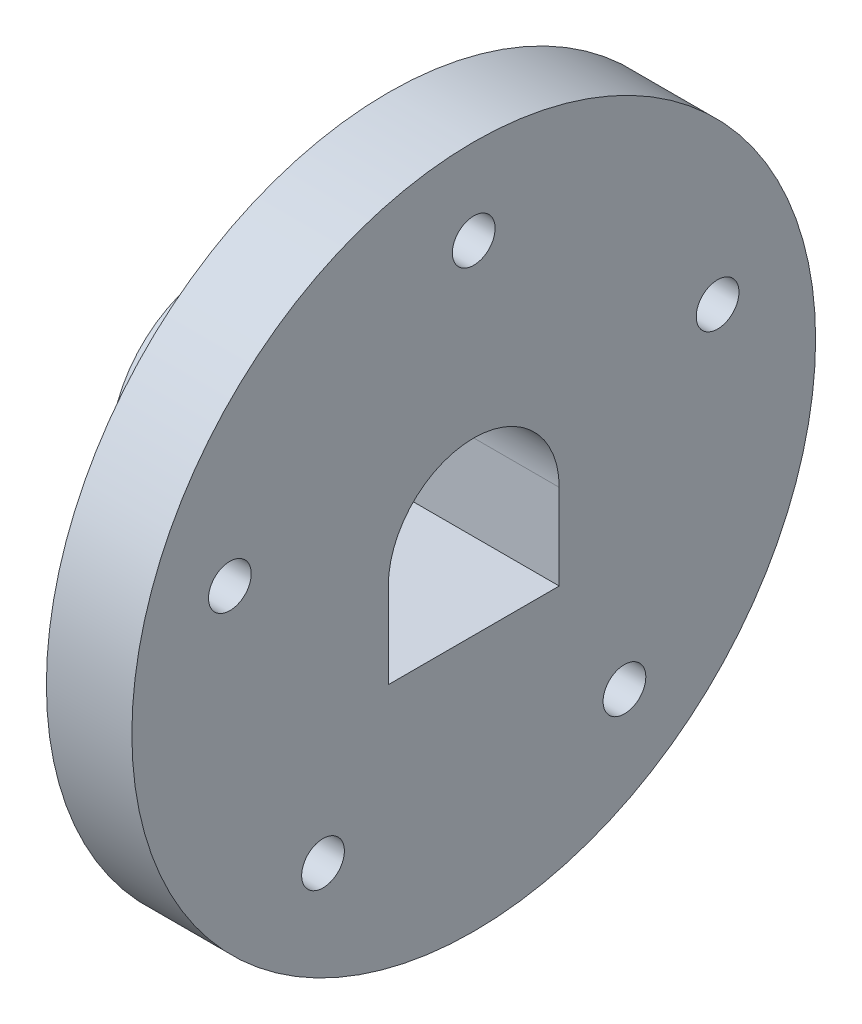
ISO-10303-21;
HEADER;
FILE_DESCRIPTION(('STEP AP214'),'2;1');
FILE_NAME('part.step','',(''),(''),'','','');
FILE_SCHEMA(('AUTOMOTIVE_DESIGN { 1 0 10303 214 1 1 1 1 }'));
ENDSEC;
DATA;
#1=APPLICATION_CONTEXT('core data for automotive mechanical design processes');
#2=APPLICATION_PROTOCOL_DEFINITION('international standard','automotive_design',2000,#1);
#3=PRODUCT_CONTEXT('',#1,'mechanical');
#4=PRODUCT('Part','Part','',(#3));
#5=PRODUCT_RELATED_PRODUCT_CATEGORY('part','',(#4));
#6=PRODUCT_DEFINITION_FORMATION('','',#4);
#7=PRODUCT_DEFINITION_CONTEXT('part definition',#1,'design');
#8=PRODUCT_DEFINITION('design','',#6,#7);
#9=PRODUCT_DEFINITION_SHAPE('','',#8);
#10=(LENGTH_UNIT() NAMED_UNIT(*) SI_UNIT(.MILLI.,.METRE.));
#11=(NAMED_UNIT(*) PLANE_ANGLE_UNIT() SI_UNIT($,.RADIAN.));
#12=(NAMED_UNIT(*) SI_UNIT($,.STERADIAN.) SOLID_ANGLE_UNIT());
#13=UNCERTAINTY_MEASURE_WITH_UNIT(LENGTH_MEASURE(1.E-05),#10,'distance_accuracy_value','');
#14=(GEOMETRIC_REPRESENTATION_CONTEXT(3) GLOBAL_UNCERTAINTY_ASSIGNED_CONTEXT((#13)) GLOBAL_UNIT_ASSIGNED_CONTEXT((#10,
#11,#12)) REPRESENTATION_CONTEXT('',''));
#15=CARTESIAN_POINT('',(0.,0.,0.));
#16=DIRECTION('',(0.,0.,1.));
#17=DIRECTION('',(1.,0.,0.));
#18=AXIS2_PLACEMENT_3D('',#15,#16,#17);
#19=CARTESIAN_POINT('',(-1.,0.,0.));
#20=DIRECTION('',(1.,0.,0.));
#21=DIRECTION('',(0.,0.,-1.));
#22=AXIS2_PLACEMENT_3D('',#19,#20,#21);
#23=PLANE('',#22);
#24=CARTESIAN_POINT('',(-1.,0.,0.));
#25=DIRECTION('',(1.,0.,0.));
#26=DIRECTION('',(0.,0.,-1.));
#27=AXIS2_PLACEMENT_3D('',#24,#25,#26);
#28=CIRCLE('',#27,4.);
#29=CARTESIAN_POINT('',(-1.,0.,-4.));
#30=VERTEX_POINT('',#29);
#31=EDGE_CURVE('E11',#30,#30,#28,.T.);
#32=ORIENTED_EDGE('',*,*,#31,.F.);
#33=EDGE_LOOP('',(#32));
#34=FACE_BOUND('',#33,.T.);
#35=CARTESIAN_POINT('',(-1.,3.,0.));
#36=DIRECTION('',(1.,0.,0.));
#37=DIRECTION('',(0.,0.,-1.));
#38=AXIS2_PLACEMENT_3D('',#35,#36,#37);
#39=CIRCLE('',#38,0.25);
#40=CARTESIAN_POINT('',(-1.,3.,-0.25));
#41=VERTEX_POINT('',#40);
#42=EDGE_CURVE('E190',#41,#41,#39,.T.);
#43=ORIENTED_EDGE('',*,*,#42,.T.);
#44=EDGE_LOOP('',(#43));
#45=FACE_BOUND('',#44,.T.);
#46=CARTESIAN_POINT('',(-1.,0.927050983124834,2.85316954888546));
#47=DIRECTION('',(1.,0.,0.));
#48=DIRECTION('',(0.,0.,-1.));
#49=AXIS2_PLACEMENT_3D('',#46,#47,#48);
#50=CIRCLE('',#49,0.25);
#51=CARTESIAN_POINT('',(-1.,0.927050983124834,2.60316954888546));
#52=VERTEX_POINT('',#51);
#53=EDGE_CURVE('E184',#52,#52,#50,.T.);
#54=ORIENTED_EDGE('',*,*,#53,.T.);
#55=EDGE_LOOP('',(#54));
#56=FACE_BOUND('',#55,.T.);
#57=CARTESIAN_POINT('',(-1.,0.927050983124875,-2.85316954888545));
#58=DIRECTION('',(1.,0.,0.));
#59=DIRECTION('',(0.,0.,-1.));
#60=AXIS2_PLACEMENT_3D('',#57,#58,#59);
#61=CIRCLE('',#60,0.25);
#62=CARTESIAN_POINT('',(-1.,0.927050983124875,-3.10316954888545));
#63=VERTEX_POINT('',#62);
#64=EDGE_CURVE('E167',#63,#63,#61,.T.);
#65=ORIENTED_EDGE('',*,*,#64,.T.);
#66=EDGE_LOOP('',(#65));
#67=FACE_BOUND('',#66,.T.);
#68=CARTESIAN_POINT('',(-1.,-2.42705098312483,-1.76335575687744));
#69=DIRECTION('',(1.,0.,0.));
#70=DIRECTION('',(0.,0.,-1.));
#71=AXIS2_PLACEMENT_3D('',#68,#69,#70);
#72=CIRCLE('',#71,0.25);
#73=CARTESIAN_POINT('',(-1.,-2.42705098312483,-2.01335575687744));
#74=VERTEX_POINT('',#73);
#75=EDGE_CURVE('E175',#74,#74,#72,.T.);
#76=ORIENTED_EDGE('',*,*,#75,.T.);
#77=EDGE_LOOP('',(#76));
#78=FACE_BOUND('',#77,.T.);
#79=CARTESIAN_POINT('',(-1.,-2.42705098312485,1.76335575687741));
#80=DIRECTION('',(1.,0.,0.));
#81=DIRECTION('',(0.,0.,-1.));
#82=AXIS2_PLACEMENT_3D('',#79,#80,#81);
#83=CIRCLE('',#82,0.25);
#84=CARTESIAN_POINT('',(-1.,-2.42705098312485,1.51335575687741));
#85=VERTEX_POINT('',#84);
#86=EDGE_CURVE('E178',#85,#85,#83,.T.);
#87=ORIENTED_EDGE('',*,*,#86,.T.);
#88=EDGE_LOOP('',(#87));
#89=FACE_BOUND('',#88,.T.);
#90=DIRECTION('',(0.,0.,1.));
#91=VECTOR('',#90,1.);
#92=CARTESIAN_POINT('',(-1.,-1.25,0.));
#93=LINE('',#92,#91);
#94=CARTESIAN_POINT('',(-1.,-1.25,-1.25));
#95=VERTEX_POINT('',#94);
#96=CARTESIAN_POINT('',(-1.,-1.25,1.25));
#97=VERTEX_POINT('',#96);
#98=EDGE_CURVE('E136',#95,#97,#93,.T.);
#99=ORIENTED_EDGE('',*,*,#98,.F.);
#100=DIRECTION('',(0.,-1.,0.));
#101=VECTOR('',#100,1.);
#102=CARTESIAN_POINT('',(-1.,0.,-1.25));
#103=LINE('',#102,#101);
#104=CARTESIAN_POINT('',(-1.,0.,-1.25));
#105=VERTEX_POINT('',#104);
#106=EDGE_CURVE('E117',#105,#95,#103,.T.);
#107=ORIENTED_EDGE('',*,*,#106,.F.);
#108=CARTESIAN_POINT('',(-1.,0.,0.));
#109=DIRECTION('',(-1.,0.,0.));
#110=DIRECTION('',(0.,0.,1.));
#111=AXIS2_PLACEMENT_3D('',#108,#109,#110);
#112=CIRCLE('',#111,1.25);
#113=CARTESIAN_POINT('',(-1.,0.,1.25));
#114=VERTEX_POINT('',#113);
#115=EDGE_CURVE('E52',#114,#105,#112,.T.);
#116=ORIENTED_EDGE('',*,*,#115,.F.);
#117=DIRECTION('',(0.,1.,0.));
#118=VECTOR('',#117,1.);
#119=CARTESIAN_POINT('',(-1.,0.,1.25));
#120=LINE('',#119,#118);
#121=EDGE_CURVE('E47',#97,#114,#120,.T.);
#122=ORIENTED_EDGE('',*,*,#121,.F.);
#123=EDGE_LOOP('',(#99,#107,#116,#122));
#124=FACE_BOUND('',#123,.T.);
#125=ADVANCED_FACE('F32',(#34,#45,#56,#67,#78,#89,#124),#23,.F.);
#126=CARTESIAN_POINT('',(-2.5,0.,0.));
#127=DIRECTION('',(1.,0.,0.));
#128=DIRECTION('',(0.,0.,-1.));
#129=AXIS2_PLACEMENT_3D('',#126,#127,#128);
#130=CYLINDRICAL_SURFACE('',#129,1.);
#131=CARTESIAN_POINT('',(0.,0.,0.));
#132=DIRECTION('',(1.,0.,0.));
#133=DIRECTION('',(0.,0.,-1.));
#134=AXIS2_PLACEMENT_3D('',#131,#132,#133);
#135=CIRCLE('',#134,1.);
#136=CARTESIAN_POINT('',(0.,0.,-1.));
#137=VERTEX_POINT('',#136);
#138=CARTESIAN_POINT('',(0.,0.,1.));
#139=VERTEX_POINT('',#138);
#140=EDGE_CURVE('E193',#137,#139,#135,.T.);
#141=ORIENTED_EDGE('',*,*,#140,.T.);
#142=DIRECTION('',(-1.,0.,0.));
#143=VECTOR('',#142,1.);
#144=CARTESIAN_POINT('',(0.,0.,1.));
#145=LINE('',#144,#143);
#146=CARTESIAN_POINT('',(-3.,0.,1.));
#147=VERTEX_POINT('',#146);
#148=EDGE_CURVE('E152',#139,#147,#145,.T.);
#149=ORIENTED_EDGE('',*,*,#148,.T.);
#150=CARTESIAN_POINT('',(-3.,0.,0.));
#151=DIRECTION('',(-1.,0.,0.));
#152=DIRECTION('',(0.,0.,1.));
#153=AXIS2_PLACEMENT_3D('',#150,#151,#152);
#154=CIRCLE('',#153,1.);
#155=CARTESIAN_POINT('',(-3.,0.,-1.));
#156=VERTEX_POINT('',#155);
#157=EDGE_CURVE('E116',#156,#147,#154,.F.);
#158=ORIENTED_EDGE('',*,*,#157,.F.);
#159=DIRECTION('',(-1.,0.,0.));
#160=VECTOR('',#159,1.);
#161=CARTESIAN_POINT('',(0.,0.,-1.));
#162=LINE('',#161,#160);
#163=EDGE_CURVE('E160',#137,#156,#162,.T.);
#164=ORIENTED_EDGE('',*,*,#163,.F.);
#165=EDGE_LOOP('',(#141,#149,#158,#164));
#166=FACE_BOUND('',#165,.T.);
#167=ADVANCED_FACE('F204',(#166),#130,.F.);
#168=CARTESIAN_POINT('',(-1.,0.,0.));
#169=DIRECTION('',(1.,0.,0.));
#170=DIRECTION('',(0.,0.,-1.));
#171=AXIS2_PLACEMENT_3D('',#168,#169,#170);
#172=CYLINDRICAL_SURFACE('',#171,4.);
#173=ORIENTED_EDGE('',*,*,#31,.T.);
#174=EDGE_LOOP('',(#173));
#175=FACE_BOUND('',#174,.T.);
#176=CARTESIAN_POINT('',(0.,0.,0.));
#177=DIRECTION('',(1.,0.,0.));
#178=DIRECTION('',(0.,0.,-1.));
#179=AXIS2_PLACEMENT_3D('',#176,#177,#178);
#180=CIRCLE('',#179,4.);
#181=CARTESIAN_POINT('',(0.,0.,-4.));
#182=VERTEX_POINT('',#181);
#183=EDGE_CURVE('E36',#182,#182,#180,.T.);
#184=ORIENTED_EDGE('',*,*,#183,.F.);
#185=EDGE_LOOP('',(#184));
#186=FACE_BOUND('',#185,.T.);
#187=ADVANCED_FACE('F34',(#175,#186),#172,.T.);
#188=CARTESIAN_POINT('',(0.,0.,0.));
#189=DIRECTION('',(1.,0.,0.));
#190=DIRECTION('',(0.,0.,-1.));
#191=AXIS2_PLACEMENT_3D('',#188,#189,#190);
#192=PLANE('',#191);
#193=DIRECTION('',(0.,0.,1.));
#194=VECTOR('',#193,1.);
#195=CARTESIAN_POINT('',(0.,-1.,0.));
#196=LINE('',#195,#194);
#197=CARTESIAN_POINT('',(0.,-1.,-1.));
#198=VERTEX_POINT('',#197);
#199=CARTESIAN_POINT('',(0.,-1.,1.));
#200=VERTEX_POINT('',#199);
#201=EDGE_CURVE('E158',#198,#200,#196,.T.);
#202=ORIENTED_EDGE('',*,*,#201,.T.);
#203=DIRECTION('',(0.,1.,0.));
#204=VECTOR('',#203,1.);
#205=CARTESIAN_POINT('',(0.,0.,1.));
#206=LINE('',#205,#204);
#207=EDGE_CURVE('E101',#200,#139,#206,.T.);
#208=ORIENTED_EDGE('',*,*,#207,.T.);
#209=ORIENTED_EDGE('',*,*,#140,.F.);
#210=DIRECTION('',(0.,-1.,0.));
#211=VECTOR('',#210,1.);
#212=CARTESIAN_POINT('',(0.,0.,-1.));
#213=LINE('',#212,#211);
#214=EDGE_CURVE('E154',#137,#198,#213,.T.);
#215=ORIENTED_EDGE('',*,*,#214,.T.);
#216=EDGE_LOOP('',(#202,#208,#209,#215));
#217=FACE_BOUND('',#216,.T.);
#218=CARTESIAN_POINT('',(0.,-2.42705098312485,1.76335575687741));
#219=DIRECTION('',(1.,0.,0.));
#220=DIRECTION('',(0.,0.587785252292469,0.809016994374951));
#221=AXIS2_PLACEMENT_3D('',#218,#219,#220);
#222=CIRCLE('',#221,0.25);
#223=CARTESIAN_POINT('',(0.,-2.28010467005174,1.96561000547114));
#224=VERTEX_POINT('',#223);
#225=EDGE_CURVE('E164',#224,#224,#222,.T.);
#226=ORIENTED_EDGE('',*,*,#225,.F.);
#227=EDGE_LOOP('',(#226));
#228=FACE_BOUND('',#227,.T.);
#229=CARTESIAN_POINT('',(0.,-2.42705098312483,-1.76335575687744));
#230=DIRECTION('',(1.,0.,0.));
#231=DIRECTION('',(0.,-0.58778525229248,0.809016994374942));
#232=AXIS2_PLACEMENT_3D('',#229,#230,#231);
#233=CIRCLE('',#232,0.25);
#234=CARTESIAN_POINT('',(0.,-2.57399729619795,-1.56110150828371));
#235=VERTEX_POINT('',#234);
#236=EDGE_CURVE('E168',#235,#235,#233,.T.);
#237=ORIENTED_EDGE('',*,*,#236,.F.);
#238=EDGE_LOOP('',(#237));
#239=FACE_BOUND('',#238,.T.);
#240=CARTESIAN_POINT('',(0.,0.927050983124875,-2.85316954888545));
#241=DIRECTION('',(1.,0.,0.));
#242=DIRECTION('',(0.,-0.95105651629515,-0.309016994374958));
#243=AXIS2_PLACEMENT_3D('',#240,#241,#242);
#244=CIRCLE('',#243,0.25);
#245=CARTESIAN_POINT('',(0.,0.689286854051087,-2.93042379747919));
#246=VERTEX_POINT('',#245);
#247=EDGE_CURVE('E162',#246,#246,#244,.T.);
#248=ORIENTED_EDGE('',*,*,#247,.F.);
#249=EDGE_LOOP('',(#248));
#250=FACE_BOUND('',#249,.T.);
#251=CARTESIAN_POINT('',(0.,0.927050983124834,2.85316954888546));
#252=DIRECTION('',(1.,0.,0.));
#253=DIRECTION('',(0.,0.951056516295155,-0.309016994374945));
#254=AXIS2_PLACEMENT_3D('',#251,#252,#253);
#255=CIRCLE('',#254,0.25);
#256=CARTESIAN_POINT('',(0.,1.16481511219862,2.77591530029173));
#257=VERTEX_POINT('',#256);
#258=EDGE_CURVE('E181',#257,#257,#255,.T.);
#259=ORIENTED_EDGE('',*,*,#258,.F.);
#260=EDGE_LOOP('',(#259));
#261=FACE_BOUND('',#260,.T.);
#262=CARTESIAN_POINT('',(0.,3.,0.));
#263=DIRECTION('',(1.,0.,0.));
#264=DIRECTION('',(0.,0.,-1.));
#265=AXIS2_PLACEMENT_3D('',#262,#263,#264);
#266=CIRCLE('',#265,0.25);
#267=CARTESIAN_POINT('',(0.,3.,-0.25));
#268=VERTEX_POINT('',#267);
#269=EDGE_CURVE('E187',#268,#268,#266,.T.);
#270=ORIENTED_EDGE('',*,*,#269,.F.);
#271=EDGE_LOOP('',(#270));
#272=FACE_BOUND('',#271,.T.);
#273=ORIENTED_EDGE('',*,*,#183,.T.);
#274=EDGE_LOOP('',(#273));
#275=FACE_BOUND('',#274,.T.);
#276=ADVANCED_FACE('F201',(#217,#228,#239,#250,#261,#272,#275),#192,.T.);
#277=CARTESIAN_POINT('',(-2.,3.,0.));
#278=DIRECTION('',(1.,0.,0.));
#279=DIRECTION('',(0.,0.,-1.));
#280=AXIS2_PLACEMENT_3D('',#277,#278,#279);
#281=CYLINDRICAL_SURFACE('',#280,0.25);
#282=ORIENTED_EDGE('',*,*,#269,.T.);
#283=EDGE_LOOP('',(#282));
#284=FACE_BOUND('',#283,.T.);
#285=ORIENTED_EDGE('',*,*,#42,.F.);
#286=EDGE_LOOP('',(#285));
#287=FACE_BOUND('',#286,.T.);
#288=ADVANCED_FACE('F210',(#284,#287),#281,.F.);
#289=CARTESIAN_POINT('',(-2.,0.927050983124834,2.85316954888546));
#290=DIRECTION('',(1.,0.,0.));
#291=DIRECTION('',(0.,0.,-1.));
#292=AXIS2_PLACEMENT_3D('',#289,#290,#291);
#293=CYLINDRICAL_SURFACE('',#292,0.25);
#294=ORIENTED_EDGE('',*,*,#258,.T.);
#295=EDGE_LOOP('',(#294));
#296=FACE_BOUND('',#295,.T.);
#297=ORIENTED_EDGE('',*,*,#53,.F.);
#298=EDGE_LOOP('',(#297));
#299=FACE_BOUND('',#298,.T.);
#300=ADVANCED_FACE('F223',(#296,#299),#293,.F.);
#301=CARTESIAN_POINT('',(-2.,0.927050983124875,-2.85316954888545));
#302=DIRECTION('',(1.,0.,0.));
#303=DIRECTION('',(0.,0.,-1.));
#304=AXIS2_PLACEMENT_3D('',#301,#302,#303);
#305=CYLINDRICAL_SURFACE('',#304,0.25);
#306=ORIENTED_EDGE('',*,*,#247,.T.);
#307=EDGE_LOOP('',(#306));
#308=FACE_BOUND('',#307,.T.);
#309=ORIENTED_EDGE('',*,*,#64,.F.);
#310=EDGE_LOOP('',(#309));
#311=FACE_BOUND('',#310,.T.);
#312=ADVANCED_FACE('F227',(#308,#311),#305,.F.);
#313=CARTESIAN_POINT('',(-2.,-2.42705098312483,-1.76335575687744));
#314=DIRECTION('',(1.,0.,0.));
#315=DIRECTION('',(0.,0.,-1.));
#316=AXIS2_PLACEMENT_3D('',#313,#314,#315);
#317=CYLINDRICAL_SURFACE('',#316,0.25);
#318=ORIENTED_EDGE('',*,*,#236,.T.);
#319=EDGE_LOOP('',(#318));
#320=FACE_BOUND('',#319,.T.);
#321=ORIENTED_EDGE('',*,*,#75,.F.);
#322=EDGE_LOOP('',(#321));
#323=FACE_BOUND('',#322,.T.);
#324=ADVANCED_FACE('F231',(#320,#323),#317,.F.);
#325=CARTESIAN_POINT('',(-2.,-2.42705098312485,1.76335575687741));
#326=DIRECTION('',(1.,0.,0.));
#327=DIRECTION('',(0.,0.,-1.));
#328=AXIS2_PLACEMENT_3D('',#325,#326,#327);
#329=CYLINDRICAL_SURFACE('',#328,0.25);
#330=ORIENTED_EDGE('',*,*,#225,.T.);
#331=EDGE_LOOP('',(#330));
#332=FACE_BOUND('',#331,.T.);
#333=ORIENTED_EDGE('',*,*,#86,.F.);
#334=EDGE_LOOP('',(#333));
#335=FACE_BOUND('',#334,.T.);
#336=ADVANCED_FACE('F235',(#332,#335),#329,.F.);
#337=CARTESIAN_POINT('',(0.,0.,-1.));
#338=DIRECTION('',(0.,0.,-1.));
#339=DIRECTION('',(-1.,0.,0.));
#340=AXIS2_PLACEMENT_3D('',#337,#338,#339);
#341=PLANE('',#340);
#342=ORIENTED_EDGE('',*,*,#163,.T.);
#343=DIRECTION('',(0.,-1.,0.));
#344=VECTOR('',#343,1.);
#345=CARTESIAN_POINT('',(-3.,0.,-1.));
#346=LINE('',#345,#344);
#347=CARTESIAN_POINT('',(-3.,-1.,-1.));
#348=VERTEX_POINT('',#347);
#349=EDGE_CURVE('E121',#156,#348,#346,.T.);
#350=ORIENTED_EDGE('',*,*,#349,.T.);
#351=DIRECTION('',(-1.,0.,0.));
#352=VECTOR('',#351,1.);
#353=CARTESIAN_POINT('',(0.,-1.,-1.));
#354=LINE('',#353,#352);
#355=EDGE_CURVE('E120',#198,#348,#354,.T.);
#356=ORIENTED_EDGE('',*,*,#355,.F.);
#357=ORIENTED_EDGE('',*,*,#214,.F.);
#358=EDGE_LOOP('',(#342,#350,#356,#357));
#359=FACE_BOUND('',#358,.T.);
#360=ADVANCED_FACE('F239',(#359),#341,.F.);
#361=CARTESIAN_POINT('',(0.,-1.,0.));
#362=DIRECTION('',(0.,-1.,0.));
#363=DIRECTION('',(0.,0.,-1.));
#364=AXIS2_PLACEMENT_3D('',#361,#362,#363);
#365=PLANE('',#364);
#366=ORIENTED_EDGE('',*,*,#355,.T.);
#367=DIRECTION('',(0.,0.,1.));
#368=VECTOR('',#367,1.);
#369=CARTESIAN_POINT('',(-3.,-1.,0.));
#370=LINE('',#369,#368);
#371=CARTESIAN_POINT('',(-3.,-1.,1.));
#372=VERTEX_POINT('',#371);
#373=EDGE_CURVE('E113',#348,#372,#370,.T.);
#374=ORIENTED_EDGE('',*,*,#373,.T.);
#375=DIRECTION('',(-1.,0.,0.));
#376=VECTOR('',#375,1.);
#377=CARTESIAN_POINT('',(0.,-1.,1.));
#378=LINE('',#377,#376);
#379=EDGE_CURVE('E96',#200,#372,#378,.T.);
#380=ORIENTED_EDGE('',*,*,#379,.F.);
#381=ORIENTED_EDGE('',*,*,#201,.F.);
#382=EDGE_LOOP('',(#366,#374,#380,#381));
#383=FACE_BOUND('',#382,.T.);
#384=ADVANCED_FACE('F119',(#383),#365,.F.);
#385=CARTESIAN_POINT('',(0.,0.,1.));
#386=DIRECTION('',(0.,0.,1.));
#387=DIRECTION('',(1.,0.,0.));
#388=AXIS2_PLACEMENT_3D('',#385,#386,#387);
#389=PLANE('',#388);
#390=ORIENTED_EDGE('',*,*,#379,.T.);
#391=DIRECTION('',(0.,1.,0.));
#392=VECTOR('',#391,1.);
#393=CARTESIAN_POINT('',(-3.,0.,1.));
#394=LINE('',#393,#392);
#395=EDGE_CURVE('E99',#372,#147,#394,.T.);
#396=ORIENTED_EDGE('',*,*,#395,.T.);
#397=ORIENTED_EDGE('',*,*,#148,.F.);
#398=ORIENTED_EDGE('',*,*,#207,.F.);
#399=EDGE_LOOP('',(#390,#396,#397,#398));
#400=FACE_BOUND('',#399,.T.);
#401=ADVANCED_FACE('F98',(#400),#389,.F.);
#402=CARTESIAN_POINT('',(-3.,-1.25,0.));
#403=DIRECTION('',(0.,1.,0.));
#404=DIRECTION('',(0.,0.,1.));
#405=AXIS2_PLACEMENT_3D('',#402,#403,#404);
#406=PLANE('',#405);
#407=ORIENTED_EDGE('',*,*,#98,.T.);
#408=DIRECTION('',(1.,0.,0.));
#409=VECTOR('',#408,1.);
#410=CARTESIAN_POINT('',(-3.,-1.25,1.25));
#411=LINE('',#410,#409);
#412=CARTESIAN_POINT('',(-3.,-1.25,1.25));
#413=VERTEX_POINT('',#412);
#414=EDGE_CURVE('E105',#413,#97,#411,.T.);
#415=ORIENTED_EDGE('',*,*,#414,.F.);
#416=DIRECTION('',(0.,0.,1.));
#417=VECTOR('',#416,1.);
#418=CARTESIAN_POINT('',(-3.,-1.25,0.));
#419=LINE('',#418,#417);
#420=CARTESIAN_POINT('',(-3.,-1.25,-1.25));
#421=VERTEX_POINT('',#420);
#422=EDGE_CURVE('E126',#421,#413,#419,.T.);
#423=ORIENTED_EDGE('',*,*,#422,.F.);
#424=DIRECTION('',(1.,0.,0.));
#425=VECTOR('',#424,1.);
#426=CARTESIAN_POINT('',(-3.,-1.25,-1.25));
#427=LINE('',#426,#425);
#428=EDGE_CURVE('E135',#421,#95,#427,.T.);
#429=ORIENTED_EDGE('',*,*,#428,.T.);
#430=EDGE_LOOP('',(#407,#415,#423,#429));
#431=FACE_BOUND('',#430,.T.);
#432=ADVANCED_FACE('F248',(#431),#406,.F.);
#433=CARTESIAN_POINT('',(-3.,0.,1.25));
#434=DIRECTION('',(0.,0.,-1.));
#435=DIRECTION('',(0.,1.,0.));
#436=AXIS2_PLACEMENT_3D('',#433,#434,#435);
#437=PLANE('',#436);
#438=ORIENTED_EDGE('',*,*,#121,.T.);
#439=DIRECTION('',(1.,0.,0.));
#440=VECTOR('',#439,1.);
#441=CARTESIAN_POINT('',(-3.,0.,1.25));
#442=LINE('',#441,#440);
#443=CARTESIAN_POINT('',(-3.,0.,1.25));
#444=VERTEX_POINT('',#443);
#445=EDGE_CURVE('E148',#444,#114,#442,.T.);
#446=ORIENTED_EDGE('',*,*,#445,.F.);
#447=DIRECTION('',(0.,1.,0.));
#448=VECTOR('',#447,1.);
#449=CARTESIAN_POINT('',(-3.,0.,1.25));
#450=LINE('',#449,#448);
#451=EDGE_CURVE('E129',#413,#444,#450,.T.);
#452=ORIENTED_EDGE('',*,*,#451,.F.);
#453=ORIENTED_EDGE('',*,*,#414,.T.);
#454=EDGE_LOOP('',(#438,#446,#452,#453));
#455=FACE_BOUND('',#454,.T.);
#456=ADVANCED_FACE('F251',(#455),#437,.F.);
#457=CARTESIAN_POINT('',(-3.,0.,0.));
#458=DIRECTION('',(1.,0.,0.));
#459=DIRECTION('',(0.,0.,-1.));
#460=AXIS2_PLACEMENT_3D('',#457,#458,#459);
#461=CYLINDRICAL_SURFACE('',#460,1.25);
#462=ORIENTED_EDGE('',*,*,#115,.T.);
#463=DIRECTION('',(1.,0.,0.));
#464=VECTOR('',#463,1.);
#465=CARTESIAN_POINT('',(-3.,0.,-1.25));
#466=LINE('',#465,#464);
#467=CARTESIAN_POINT('',(-3.,0.,-1.25));
#468=VERTEX_POINT('',#467);
#469=EDGE_CURVE('E145',#468,#105,#466,.T.);
#470=ORIENTED_EDGE('',*,*,#469,.F.);
#471=CARTESIAN_POINT('',(-3.,0.,0.));
#472=DIRECTION('',(-1.,0.,0.));
#473=DIRECTION('',(0.,0.,1.));
#474=AXIS2_PLACEMENT_3D('',#471,#472,#473);
#475=CIRCLE('',#474,1.25);
#476=EDGE_CURVE('E131',#444,#468,#475,.T.);
#477=ORIENTED_EDGE('',*,*,#476,.F.);
#478=ORIENTED_EDGE('',*,*,#445,.T.);
#479=EDGE_LOOP('',(#462,#470,#477,#478));
#480=FACE_BOUND('',#479,.T.);
#481=ADVANCED_FACE('F255',(#480),#461,.T.);
#482=CARTESIAN_POINT('',(-3.,0.,-1.25));
#483=DIRECTION('',(0.,0.,1.));
#484=DIRECTION('',(0.,-1.,0.));
#485=AXIS2_PLACEMENT_3D('',#482,#483,#484);
#486=PLANE('',#485);
#487=ORIENTED_EDGE('',*,*,#106,.T.);
#488=ORIENTED_EDGE('',*,*,#428,.F.);
#489=DIRECTION('',(0.,-1.,0.));
#490=VECTOR('',#489,1.);
#491=CARTESIAN_POINT('',(-3.,0.,-1.25));
#492=LINE('',#491,#490);
#493=EDGE_CURVE('E133',#468,#421,#492,.T.);
#494=ORIENTED_EDGE('',*,*,#493,.F.);
#495=ORIENTED_EDGE('',*,*,#469,.T.);
#496=EDGE_LOOP('',(#487,#488,#494,#495));
#497=FACE_BOUND('',#496,.T.);
#498=ADVANCED_FACE('F259',(#497),#486,.F.);
#499=CARTESIAN_POINT('',(-3.,0.,0.));
#500=DIRECTION('',(-1.,0.,0.));
#501=DIRECTION('',(0.,0.,1.));
#502=AXIS2_PLACEMENT_3D('',#499,#500,#501);
#503=PLANE('',#502);
#504=ORIENTED_EDGE('',*,*,#395,.F.);
#505=ORIENTED_EDGE('',*,*,#373,.F.);
#506=ORIENTED_EDGE('',*,*,#349,.F.);
#507=ORIENTED_EDGE('',*,*,#157,.T.);
#508=EDGE_LOOP('',(#504,#505,#506,#507));
#509=FACE_BOUND('',#508,.T.);
#510=ORIENTED_EDGE('',*,*,#422,.T.);
#511=ORIENTED_EDGE('',*,*,#451,.T.);
#512=ORIENTED_EDGE('',*,*,#476,.T.);
#513=ORIENTED_EDGE('',*,*,#493,.T.);
#514=EDGE_LOOP('',(#510,#511,#512,#513));
#515=FACE_BOUND('',#514,.T.);
#516=ADVANCED_FACE('F110',(#509,#515),#503,.T.);
#517=CLOSED_SHELL('',(#125,#167,#187,#276,#288,#300,#312,#324,#336,#360,#384,#401,#432,#456,
#481,#498,#516));
#518=MANIFOLD_SOLID_BREP('B2',#517);
#519=ADVANCED_BREP_SHAPE_REPRESENTATION('',(#18,#518),#14);
#520=SHAPE_DEFINITION_REPRESENTATION(#9,#519);
ENDSEC;
END-ISO-10303-21;
